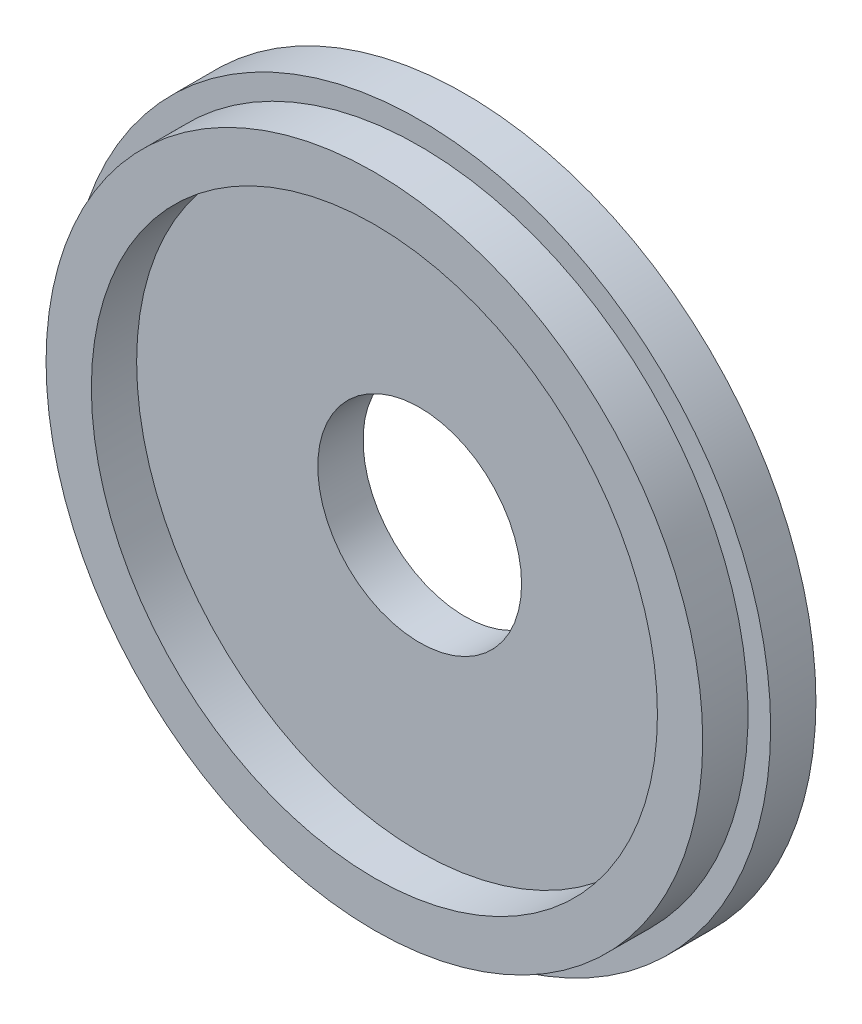
ISO-10303-21;
HEADER;
FILE_DESCRIPTION(('STEP AP214'),'2;1');
FILE_NAME('part.step','',(''),(''),'','','');
FILE_SCHEMA(('AUTOMOTIVE_DESIGN { 1 0 10303 214 1 1 1 1 }'));
ENDSEC;
DATA;
#1=APPLICATION_CONTEXT('core data for automotive mechanical design processes');
#2=APPLICATION_PROTOCOL_DEFINITION('international standard','automotive_design',2000,#1);
#3=PRODUCT_CONTEXT('',#1,'mechanical');
#4=PRODUCT('Part','Part','',(#3));
#5=PRODUCT_RELATED_PRODUCT_CATEGORY('part','',(#4));
#6=PRODUCT_DEFINITION_FORMATION('','',#4);
#7=PRODUCT_DEFINITION_CONTEXT('part definition',#1,'design');
#8=PRODUCT_DEFINITION('design','',#6,#7);
#9=PRODUCT_DEFINITION_SHAPE('','',#8);
#10=(LENGTH_UNIT() NAMED_UNIT(*) SI_UNIT(.MILLI.,.METRE.));
#11=(NAMED_UNIT(*) PLANE_ANGLE_UNIT() SI_UNIT($,.RADIAN.));
#12=(NAMED_UNIT(*) SI_UNIT($,.STERADIAN.) SOLID_ANGLE_UNIT());
#13=UNCERTAINTY_MEASURE_WITH_UNIT(LENGTH_MEASURE(1.E-05),#10,'distance_accuracy_value','');
#14=(GEOMETRIC_REPRESENTATION_CONTEXT(3) GLOBAL_UNCERTAINTY_ASSIGNED_CONTEXT((#13)) GLOBAL_UNIT_ASSIGNED_CONTEXT((#10,
#11,#12)) REPRESENTATION_CONTEXT('',''));
#15=CARTESIAN_POINT('',(0.,0.,0.));
#16=DIRECTION('',(0.,0.,1.));
#17=DIRECTION('',(1.,0.,0.));
#18=AXIS2_PLACEMENT_3D('',#15,#16,#17);
#19=CARTESIAN_POINT('',(0.,0.,2.));
#20=DIRECTION('',(0.,0.,-1.));
#21=DIRECTION('',(-1.,0.,0.));
#22=AXIS2_PLACEMENT_3D('',#19,#20,#21);
#23=CYLINDRICAL_SURFACE('',#22,14.5);
#24=CARTESIAN_POINT('',(0.,0.,4.));
#25=DIRECTION('',(0.,0.,1.));
#26=DIRECTION('',(1.,0.,0.));
#27=AXIS2_PLACEMENT_3D('',#24,#25,#26);
#28=CIRCLE('',#27,14.5);
#29=CARTESIAN_POINT('',(14.5,0.,4.));
#30=VERTEX_POINT('',#29);
#31=EDGE_CURVE('E49',#30,#30,#28,.T.);
#32=ORIENTED_EDGE('',*,*,#31,.F.);
#33=EDGE_LOOP('',(#32));
#34=FACE_BOUND('',#33,.T.);
#35=CARTESIAN_POINT('',(0.,0.,2.));
#36=DIRECTION('',(0.,0.,-1.));
#37=DIRECTION('',(-1.,0.,0.));
#38=AXIS2_PLACEMENT_3D('',#35,#36,#37);
#39=CIRCLE('',#38,14.5);
#40=CARTESIAN_POINT('',(-14.5,0.,2.));
#41=VERTEX_POINT('',#40);
#42=EDGE_CURVE('E10',#41,#41,#39,.T.);
#43=ORIENTED_EDGE('',*,*,#42,.F.);
#44=EDGE_LOOP('',(#43));
#45=FACE_BOUND('',#44,.T.);
#46=ADVANCED_FACE('F37',(#34,#45),#23,.T.);
#47=CARTESIAN_POINT('',(0.,0.,0.));
#48=DIRECTION('',(0.,0.,1.));
#49=DIRECTION('',(1.,0.,0.));
#50=AXIS2_PLACEMENT_3D('',#47,#48,#49);
#51=PLANE('',#50);
#52=CARTESIAN_POINT('',(0.,0.,0.));
#53=DIRECTION('',(0.,0.,1.));
#54=DIRECTION('',(1.,0.,0.));
#55=AXIS2_PLACEMENT_3D('',#52,#53,#54);
#56=CIRCLE('',#55,4.5);
#57=CARTESIAN_POINT('',(4.5,0.,0.));
#58=VERTEX_POINT('',#57);
#59=EDGE_CURVE('E60',#58,#58,#56,.T.);
#60=ORIENTED_EDGE('',*,*,#59,.T.);
#61=EDGE_LOOP('',(#60));
#62=FACE_BOUND('',#61,.T.);
#63=CARTESIAN_POINT('',(0.,0.,0.));
#64=DIRECTION('',(0.,0.,-1.));
#65=DIRECTION('',(-1.,0.,0.));
#66=AXIS2_PLACEMENT_3D('',#63,#64,#65);
#67=CIRCLE('',#66,15.5);
#68=CARTESIAN_POINT('',(-15.5,0.,0.));
#69=VERTEX_POINT('',#68);
#70=EDGE_CURVE('E69',#69,#69,#67,.T.);
#71=ORIENTED_EDGE('',*,*,#70,.T.);
#72=EDGE_LOOP('',(#71));
#73=FACE_BOUND('',#72,.T.);
#74=ADVANCED_FACE('F89',(#62,#73),#51,.F.);
#75=CARTESIAN_POINT('',(0.,0.,4.));
#76=DIRECTION('',(0.,0.,1.));
#77=DIRECTION('',(1.,0.,0.));
#78=AXIS2_PLACEMENT_3D('',#75,#76,#77);
#79=PLANE('',#78);
#80=ORIENTED_EDGE('',*,*,#31,.T.);
#81=EDGE_LOOP('',(#80));
#82=FACE_BOUND('',#81,.T.);
#83=CARTESIAN_POINT('',(0.,0.,4.));
#84=DIRECTION('',(0.,0.,1.));
#85=DIRECTION('',(1.,0.,0.));
#86=AXIS2_PLACEMENT_3D('',#83,#84,#85);
#87=CIRCLE('',#86,12.5);
#88=CARTESIAN_POINT('',(12.5,0.,4.));
#89=VERTEX_POINT('',#88);
#90=EDGE_CURVE('E54',#89,#89,#87,.T.);
#91=ORIENTED_EDGE('',*,*,#90,.F.);
#92=EDGE_LOOP('',(#91));
#93=FACE_BOUND('',#92,.T.);
#94=ADVANCED_FACE('F94',(#82,#93),#79,.T.);
#95=CARTESIAN_POINT('',(0.,0.,4.));
#96=DIRECTION('',(0.,0.,-1.));
#97=DIRECTION('',(-1.,0.,0.));
#98=AXIS2_PLACEMENT_3D('',#95,#96,#97);
#99=CYLINDRICAL_SURFACE('',#98,12.5);
#100=ORIENTED_EDGE('',*,*,#90,.T.);
#101=EDGE_LOOP('',(#100));
#102=FACE_BOUND('',#101,.T.);
#103=CARTESIAN_POINT('',(0.,0.,2.));
#104=DIRECTION('',(0.,0.,1.));
#105=DIRECTION('',(1.,0.,0.));
#106=AXIS2_PLACEMENT_3D('',#103,#104,#105);
#107=CIRCLE('',#106,12.5);
#108=CARTESIAN_POINT('',(12.5,0.,2.));
#109=VERTEX_POINT('',#108);
#110=EDGE_CURVE('E44',#109,#109,#107,.F.);
#111=ORIENTED_EDGE('',*,*,#110,.T.);
#112=EDGE_LOOP('',(#111));
#113=FACE_BOUND('',#112,.T.);
#114=ADVANCED_FACE('F101',(#102,#113),#99,.F.);
#115=CARTESIAN_POINT('',(0.,0.,2.));
#116=DIRECTION('',(0.,0.,1.));
#117=DIRECTION('',(1.,0.,0.));
#118=AXIS2_PLACEMENT_3D('',#115,#116,#117);
#119=PLANE('',#118);
#120=CARTESIAN_POINT('',(0.,0.,2.));
#121=DIRECTION('',(0.,0.,1.));
#122=DIRECTION('',(1.,0.,0.));
#123=AXIS2_PLACEMENT_3D('',#120,#121,#122);
#124=CIRCLE('',#123,4.5);
#125=CARTESIAN_POINT('',(4.5,0.,2.));
#126=VERTEX_POINT('',#125);
#127=EDGE_CURVE('E61',#126,#126,#124,.T.);
#128=ORIENTED_EDGE('',*,*,#127,.F.);
#129=EDGE_LOOP('',(#128));
#130=FACE_BOUND('',#129,.T.);
#131=ORIENTED_EDGE('',*,*,#110,.F.);
#132=EDGE_LOOP('',(#131));
#133=FACE_BOUND('',#132,.T.);
#134=ADVANCED_FACE('F106',(#130,#133),#119,.T.);
#135=CARTESIAN_POINT('',(0.,0.,0.));
#136=DIRECTION('',(0.,0.,1.));
#137=DIRECTION('',(1.,0.,0.));
#138=AXIS2_PLACEMENT_3D('',#135,#136,#137);
#139=CYLINDRICAL_SURFACE('',#138,4.5);
#140=ORIENTED_EDGE('',*,*,#59,.F.);
#141=EDGE_LOOP('',(#140));
#142=FACE_BOUND('',#141,.T.);
#143=ORIENTED_EDGE('',*,*,#127,.T.);
#144=EDGE_LOOP('',(#143));
#145=FACE_BOUND('',#144,.T.);
#146=ADVANCED_FACE('F86',(#142,#145),#139,.F.);
#147=CARTESIAN_POINT('',(0.,0.,2.));
#148=DIRECTION('',(0.,0.,-1.));
#149=DIRECTION('',(-1.,0.,0.));
#150=AXIS2_PLACEMENT_3D('',#147,#148,#149);
#151=CYLINDRICAL_SURFACE('',#150,15.5);
#152=CARTESIAN_POINT('',(0.,0.,2.));
#153=DIRECTION('',(0.,0.,-1.));
#154=DIRECTION('',(-1.,0.,0.));
#155=AXIS2_PLACEMENT_3D('',#152,#153,#154);
#156=CIRCLE('',#155,15.5);
#157=CARTESIAN_POINT('',(-15.5,0.,2.));
#158=VERTEX_POINT('',#157);
#159=EDGE_CURVE('E65',#158,#158,#156,.T.);
#160=ORIENTED_EDGE('',*,*,#159,.T.);
#161=EDGE_LOOP('',(#160));
#162=FACE_BOUND('',#161,.T.);
#163=ORIENTED_EDGE('',*,*,#70,.F.);
#164=EDGE_LOOP('',(#163));
#165=FACE_BOUND('',#164,.T.);
#166=ADVANCED_FACE('F77',(#162,#165),#151,.T.);
#167=CARTESIAN_POINT('',(0.,0.,2.));
#168=DIRECTION('',(0.,0.,-1.));
#169=DIRECTION('',(-1.,0.,0.));
#170=AXIS2_PLACEMENT_3D('',#167,#168,#169);
#171=PLANE('',#170);
#172=ORIENTED_EDGE('',*,*,#42,.T.);
#173=EDGE_LOOP('',(#172));
#174=FACE_BOUND('',#173,.T.);
#175=ORIENTED_EDGE('',*,*,#159,.F.);
#176=EDGE_LOOP('',(#175));
#177=FACE_BOUND('',#176,.T.);
#178=ADVANCED_FACE('F80',(#174,#177),#171,.F.);
#179=CLOSED_SHELL('',(#46,#74,#94,#114,#134,#146,#166,#178));
#180=MANIFOLD_SOLID_BREP('B2',#179);
#181=ADVANCED_BREP_SHAPE_REPRESENTATION('',(#18,#180),#14);
#182=SHAPE_DEFINITION_REPRESENTATION(#9,#181);
ENDSEC;
END-ISO-10303-21;
